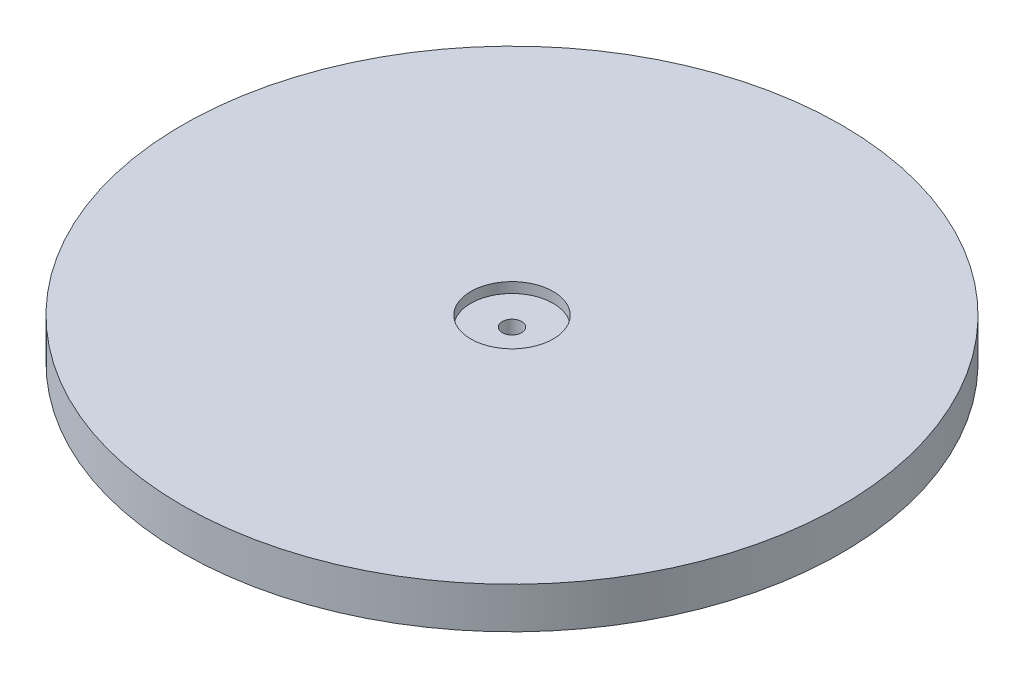
ISO-10303-21;
HEADER;
FILE_DESCRIPTION(('STEP AP214'),'2;1');
FILE_NAME('part.step','',(''),(''),'','','');
FILE_SCHEMA(('AUTOMOTIVE_DESIGN { 1 0 10303 214 1 1 1 1 }'));
ENDSEC;
DATA;
#1=APPLICATION_CONTEXT('core data for automotive mechanical design processes');
#2=APPLICATION_PROTOCOL_DEFINITION('international standard','automotive_design',2000,#1);
#3=PRODUCT_CONTEXT('',#1,'mechanical');
#4=PRODUCT('Part','Part','',(#3));
#5=PRODUCT_RELATED_PRODUCT_CATEGORY('part','',(#4));
#6=PRODUCT_DEFINITION_FORMATION('','',#4);
#7=PRODUCT_DEFINITION_CONTEXT('part definition',#1,'design');
#8=PRODUCT_DEFINITION('design','',#6,#7);
#9=PRODUCT_DEFINITION_SHAPE('','',#8);
#10=(LENGTH_UNIT() NAMED_UNIT(*) SI_UNIT(.MILLI.,.METRE.));
#11=(NAMED_UNIT(*) PLANE_ANGLE_UNIT() SI_UNIT($,.RADIAN.));
#12=(NAMED_UNIT(*) SI_UNIT($,.STERADIAN.) SOLID_ANGLE_UNIT());
#13=UNCERTAINTY_MEASURE_WITH_UNIT(LENGTH_MEASURE(1.E-05),#10,'distance_accuracy_value','');
#14=(GEOMETRIC_REPRESENTATION_CONTEXT(3) GLOBAL_UNCERTAINTY_ASSIGNED_CONTEXT((#13)) GLOBAL_UNIT_ASSIGNED_CONTEXT((#10,
#11,#12)) REPRESENTATION_CONTEXT('',''));
#15=CARTESIAN_POINT('',(0.,0.,0.));
#16=DIRECTION('',(0.,0.,1.));
#17=DIRECTION('',(1.,0.,0.));
#18=AXIS2_PLACEMENT_3D('',#15,#16,#17);
#19=CARTESIAN_POINT('',(0.,12.7,0.));
#20=DIRECTION('',(0.,-1.,0.));
#21=DIRECTION('',(0.,0.,-1.));
#22=AXIS2_PLACEMENT_3D('',#19,#20,#21);
#23=CYLINDRICAL_SURFACE('',#22,101.6);
#24=CARTESIAN_POINT('',(0.,19.05,0.));
#25=DIRECTION('',(0.,1.,0.));
#26=DIRECTION('',(0.,0.,1.));
#27=AXIS2_PLACEMENT_3D('',#24,#25,#26);
#28=CIRCLE('',#27,101.6);
#29=CARTESIAN_POINT('',(0.,19.05,101.6));
#30=VERTEX_POINT('',#29);
#31=EDGE_CURVE('E10',#30,#30,#28,.T.);
#32=ORIENTED_EDGE('',*,*,#31,.F.);
#33=EDGE_LOOP('',(#32));
#34=FACE_BOUND('',#33,.T.);
#35=CARTESIAN_POINT('',(0.,6.35,0.));
#36=DIRECTION('',(0.,-1.,0.));
#37=DIRECTION('',(0.,0.,-1.));
#38=AXIS2_PLACEMENT_3D('',#35,#36,#37);
#39=CIRCLE('',#38,101.6);
#40=CARTESIAN_POINT('',(0.,6.35,-101.6));
#41=VERTEX_POINT('',#40);
#42=EDGE_CURVE('E46',#41,#41,#39,.T.);
#43=ORIENTED_EDGE('',*,*,#42,.F.);
#44=EDGE_LOOP('',(#43));
#45=FACE_BOUND('',#44,.T.);
#46=ADVANCED_FACE('F33',(#34,#45),#23,.T.);
#47=CARTESIAN_POINT('',(0.,12.7,0.));
#48=DIRECTION('',(0.,-1.,0.));
#49=DIRECTION('',(0.,0.,-1.));
#50=AXIS2_PLACEMENT_3D('',#47,#48,#49);
#51=CYLINDRICAL_SURFACE('',#50,3.);
#52=CARTESIAN_POINT('',(0.,6.35,0.));
#53=DIRECTION('',(0.,-1.,0.));
#54=DIRECTION('',(0.,0.,-1.));
#55=AXIS2_PLACEMENT_3D('',#52,#53,#54);
#56=CIRCLE('',#55,3.);
#57=CARTESIAN_POINT('',(0.,6.35,-3.));
#58=VERTEX_POINT('',#57);
#59=EDGE_CURVE('E36',#58,#58,#56,.T.);
#60=ORIENTED_EDGE('',*,*,#59,.T.);
#61=EDGE_LOOP('',(#60));
#62=FACE_BOUND('',#61,.T.);
#63=CARTESIAN_POINT('',(0.,15.875,0.));
#64=DIRECTION('',(0.,-1.,0.));
#65=DIRECTION('',(0.,0.,-1.));
#66=AXIS2_PLACEMENT_3D('',#63,#64,#65);
#67=CIRCLE('',#66,3.);
#68=CARTESIAN_POINT('',(0.,15.875,-3.));
#69=VERTEX_POINT('',#68);
#70=EDGE_CURVE('E52',#69,#69,#67,.T.);
#71=ORIENTED_EDGE('',*,*,#70,.F.);
#72=EDGE_LOOP('',(#71));
#73=FACE_BOUND('',#72,.T.);
#74=ADVANCED_FACE('F59',(#62,#73),#51,.F.);
#75=CARTESIAN_POINT('',(0.,19.05,0.));
#76=DIRECTION('',(0.,1.,0.));
#77=DIRECTION('',(0.,0.,1.));
#78=AXIS2_PLACEMENT_3D('',#75,#76,#77);
#79=PLANE('',#78);
#80=CARTESIAN_POINT('',(0.,19.05,0.));
#81=DIRECTION('',(0.,1.,0.));
#82=DIRECTION('',(0.,0.,1.));
#83=AXIS2_PLACEMENT_3D('',#80,#81,#82);
#84=CIRCLE('',#83,12.7);
#85=CARTESIAN_POINT('',(0.,19.05,12.7));
#86=VERTEX_POINT('',#85);
#87=EDGE_CURVE('E40',#86,#86,#84,.T.);
#88=ORIENTED_EDGE('',*,*,#87,.F.);
#89=EDGE_LOOP('',(#88));
#90=FACE_BOUND('',#89,.T.);
#91=ORIENTED_EDGE('',*,*,#31,.T.);
#92=EDGE_LOOP('',(#91));
#93=FACE_BOUND('',#92,.T.);
#94=ADVANCED_FACE('F61',(#90,#93),#79,.T.);
#95=CARTESIAN_POINT('',(0.,12.7,0.));
#96=DIRECTION('',(0.,1.,0.));
#97=DIRECTION('',(0.,0.,1.));
#98=AXIS2_PLACEMENT_3D('',#95,#96,#97);
#99=CYLINDRICAL_SURFACE('',#98,12.7);
#100=CARTESIAN_POINT('',(0.,15.875,0.));
#101=DIRECTION('',(0.,1.,0.));
#102=DIRECTION('',(0.,0.,1.));
#103=AXIS2_PLACEMENT_3D('',#100,#101,#102);
#104=CIRCLE('',#103,12.7);
#105=CARTESIAN_POINT('',(0.,15.875,12.7));
#106=VERTEX_POINT('',#105);
#107=EDGE_CURVE('E49',#106,#106,#104,.T.);
#108=ORIENTED_EDGE('',*,*,#107,.F.);
#109=EDGE_LOOP('',(#108));
#110=FACE_BOUND('',#109,.T.);
#111=ORIENTED_EDGE('',*,*,#87,.T.);
#112=EDGE_LOOP('',(#111));
#113=FACE_BOUND('',#112,.T.);
#114=ADVANCED_FACE('F67',(#110,#113),#99,.F.);
#115=CARTESIAN_POINT('',(0.,6.35,0.));
#116=DIRECTION('',(0.,-1.,0.));
#117=DIRECTION('',(0.,0.,-1.));
#118=AXIS2_PLACEMENT_3D('',#115,#116,#117);
#119=PLANE('',#118);
#120=ORIENTED_EDGE('',*,*,#59,.F.);
#121=EDGE_LOOP('',(#120));
#122=FACE_BOUND('',#121,.T.);
#123=ORIENTED_EDGE('',*,*,#42,.T.);
#124=EDGE_LOOP('',(#123));
#125=FACE_BOUND('',#124,.T.);
#126=ADVANCED_FACE('F75',(#122,#125),#119,.T.);
#127=CARTESIAN_POINT('',(0.,15.875,0.));
#128=DIRECTION('',(0.,1.,0.));
#129=DIRECTION('',(0.,0.,1.));
#130=AXIS2_PLACEMENT_3D('',#127,#128,#129);
#131=PLANE('',#130);
#132=ORIENTED_EDGE('',*,*,#70,.T.);
#133=EDGE_LOOP('',(#132));
#134=FACE_BOUND('',#133,.T.);
#135=ORIENTED_EDGE('',*,*,#107,.T.);
#136=EDGE_LOOP('',(#135));
#137=FACE_BOUND('',#136,.T.);
#138=ADVANCED_FACE('F56',(#134,#137),#131,.T.);
#139=CLOSED_SHELL('',(#46,#74,#94,#114,#126,#138));
#140=MANIFOLD_SOLID_BREP('B2',#139);
#141=ADVANCED_BREP_SHAPE_REPRESENTATION('',(#18,#140),#14);
#142=SHAPE_DEFINITION_REPRESENTATION(#9,#141);
ENDSEC;
END-ISO-10303-21;
